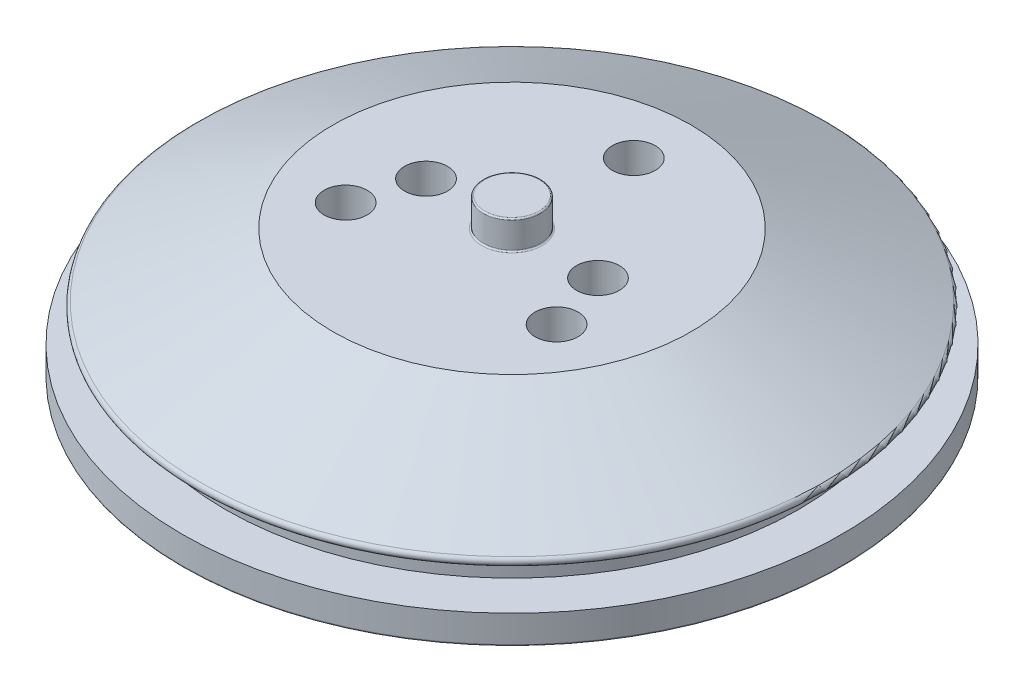
ISO-10303-21;
HEADER;
FILE_DESCRIPTION(('STEP AP214'),'2;1');
FILE_NAME('part.step','',(''),(''),'','','');
FILE_SCHEMA(('AUTOMOTIVE_DESIGN { 1 0 10303 214 1 1 1 1 }'));
ENDSEC;
DATA;
#1=APPLICATION_CONTEXT('core data for automotive mechanical design processes');
#2=APPLICATION_PROTOCOL_DEFINITION('international standard','automotive_design',2000,#1);
#3=PRODUCT_CONTEXT('',#1,'mechanical');
#4=PRODUCT('Part','Part','',(#3));
#5=PRODUCT_RELATED_PRODUCT_CATEGORY('part','',(#4));
#6=PRODUCT_DEFINITION_FORMATION('','',#4);
#7=PRODUCT_DEFINITION_CONTEXT('part definition',#1,'design');
#8=PRODUCT_DEFINITION('design','',#6,#7);
#9=PRODUCT_DEFINITION_SHAPE('','',#8);
#10=(LENGTH_UNIT() NAMED_UNIT(*) SI_UNIT(.MILLI.,.METRE.));
#11=(NAMED_UNIT(*) PLANE_ANGLE_UNIT() SI_UNIT($,.RADIAN.));
#12=(NAMED_UNIT(*) SI_UNIT($,.STERADIAN.) SOLID_ANGLE_UNIT());
#13=UNCERTAINTY_MEASURE_WITH_UNIT(LENGTH_MEASURE(1.E-05),#10,'distance_accuracy_value','');
#14=(GEOMETRIC_REPRESENTATION_CONTEXT(3) GLOBAL_UNCERTAINTY_ASSIGNED_CONTEXT((#13)) GLOBAL_UNIT_ASSIGNED_CONTEXT((#10,
#11,#12)) REPRESENTATION_CONTEXT('',''));
#15=CARTESIAN_POINT('',(0.,0.,0.));
#16=DIRECTION('',(0.,0.,1.));
#17=DIRECTION('',(1.,0.,0.));
#18=AXIS2_PLACEMENT_3D('',#15,#16,#17);
#19=CARTESIAN_POINT('',(0.,2.,0.));
#20=DIRECTION('',(0.,1.,0.));
#21=DIRECTION('',(0.,0.,1.));
#22=AXIS2_PLACEMENT_3D('',#19,#20,#21);
#23=PLANE('',#22);
#24=CARTESIAN_POINT('',(0.,2.,0.));
#25=DIRECTION('',(0.,-1.,0.));
#26=DIRECTION('',(0.,0.,-1.));
#27=AXIS2_PLACEMENT_3D('',#24,#25,#26);
#28=CIRCLE('',#27,1.9);
#29=CARTESIAN_POINT('',(0.,2.,-1.9));
#30=VERTEX_POINT('',#29);
#31=CARTESIAN_POINT('',(0.,2.,1.9));
#32=VERTEX_POINT('',#31);
#33=EDGE_CURVE('E63',#30,#32,#28,.T.);
#34=ORIENTED_EDGE('',*,*,#33,.F.);
#35=CARTESIAN_POINT('',(0.,2.,0.));
#36=DIRECTION('',(0.,-1.,0.));
#37=DIRECTION('',(0.,0.,1.));
#38=AXIS2_PLACEMENT_3D('',#35,#36,#37);
#39=CIRCLE('',#38,1.9);
#40=EDGE_CURVE('E61',#32,#30,#39,.T.);
#41=ORIENTED_EDGE('',*,*,#40,.F.);
#42=EDGE_LOOP('',(#34,#41));
#43=FACE_BOUND('',#42,.T.);
#44=ADVANCED_FACE('F24',(#43),#23,.T.);
#45=CARTESIAN_POINT('',(0.,1.9,0.));
#46=DIRECTION('',(0.,1.,0.));
#47=DIRECTION('',(0.,0.,1.));
#48=AXIS2_PLACEMENT_3D('',#45,#46,#47);
#49=TOROIDAL_SURFACE('',#48,1.9,0.1);
#50=ORIENTED_EDGE('',*,*,#40,.T.);
#51=ORIENTED_EDGE('',*,*,#33,.T.);
#52=EDGE_LOOP('',(#50,#51));
#53=FACE_BOUND('',#52,.T.);
#54=CARTESIAN_POINT('',(0.,1.9,0.));
#55=DIRECTION('',(0.,-1.,0.));
#56=DIRECTION('',(0.,0.,-1.));
#57=AXIS2_PLACEMENT_3D('',#54,#55,#56);
#58=CIRCLE('',#57,2.);
#59=CARTESIAN_POINT('',(0.,1.9,-2.));
#60=VERTEX_POINT('',#59);
#61=EDGE_CURVE('E69',#60,#60,#58,.T.);
#62=ORIENTED_EDGE('',*,*,#61,.F.);
#63=EDGE_LOOP('',(#62));
#64=FACE_BOUND('',#63,.T.);
#65=ADVANCED_FACE('F65',(#53,#64),#49,.T.);
#66=CARTESIAN_POINT('',(0.,2.,0.));
#67=DIRECTION('',(0.,-1.,0.));
#68=DIRECTION('',(0.,0.,-1.));
#69=AXIS2_PLACEMENT_3D('',#66,#67,#68);
#70=CYLINDRICAL_SURFACE('',#69,2.);
#71=CARTESIAN_POINT('',(0.,0.1,0.));
#72=DIRECTION('',(0.,1.,0.));
#73=DIRECTION('',(0.,0.,1.));
#74=AXIS2_PLACEMENT_3D('',#71,#72,#73);
#75=CIRCLE('',#74,2.);
#76=CARTESIAN_POINT('',(0.,0.1,2.));
#77=VERTEX_POINT('',#76);
#78=EDGE_CURVE('E153',#77,#77,#75,.T.);
#79=ORIENTED_EDGE('',*,*,#78,.T.);
#80=EDGE_LOOP('',(#79));
#81=FACE_BOUND('',#80,.T.);
#82=ORIENTED_EDGE('',*,*,#61,.T.);
#83=EDGE_LOOP('',(#82));
#84=FACE_BOUND('',#83,.T.);
#85=ADVANCED_FACE('F95',(#81,#84),#70,.T.);
#86=CARTESIAN_POINT('',(0.,-5.,0.));
#87=DIRECTION('',(0.,1.,0.));
#88=DIRECTION('',(0.,0.,1.));
#89=AXIS2_PLACEMENT_3D('',#86,#87,#88);
#90=PLANE('',#89);
#91=CARTESIAN_POINT('',(0.,-5.,-8.5));
#92=DIRECTION('',(0.,1.,0.));
#93=DIRECTION('',(0.,0.,1.));
#94=AXIS2_PLACEMENT_3D('',#91,#92,#93);
#95=CIRCLE('',#94,1.5);
#96=CARTESIAN_POINT('',(0.,-5.,-7.));
#97=VERTEX_POINT('',#96);
#98=EDGE_CURVE('E150',#97,#97,#95,.T.);
#99=ORIENTED_EDGE('',*,*,#98,.T.);
#100=EDGE_LOOP('',(#99));
#101=FACE_BOUND('',#100,.T.);
#102=ADVANCED_FACE('F317',(#101),#90,.T.);
#103=CARTESIAN_POINT('',(0.,-5.,0.));
#104=DIRECTION('',(0.,1.,0.));
#105=DIRECTION('',(0.,0.,1.));
#106=AXIS2_PLACEMENT_3D('',#103,#104,#105);
#107=PLANE('',#106);
#108=CARTESIAN_POINT('',(6.,-5.,0.));
#109=DIRECTION('',(0.,1.,0.));
#110=DIRECTION('',(0.,0.,1.));
#111=AXIS2_PLACEMENT_3D('',#108,#109,#110);
#112=CIRCLE('',#111,1.5);
#113=CARTESIAN_POINT('',(6.,-5.,1.5));
#114=VERTEX_POINT('',#113);
#115=EDGE_CURVE('E147',#114,#114,#112,.T.);
#116=ORIENTED_EDGE('',*,*,#115,.T.);
#117=EDGE_LOOP('',(#116));
#118=FACE_BOUND('',#117,.T.);
#119=ADVANCED_FACE('F322',(#118),#107,.T.);
#120=CARTESIAN_POINT('',(0.,-5.,0.));
#121=DIRECTION('',(0.,1.,0.));
#122=DIRECTION('',(0.,0.,1.));
#123=AXIS2_PLACEMENT_3D('',#120,#121,#122);
#124=PLANE('',#123);
#125=CARTESIAN_POINT('',(-6.,-5.,0.));
#126=DIRECTION('',(0.,1.,0.));
#127=DIRECTION('',(0.,0.,1.));
#128=AXIS2_PLACEMENT_3D('',#125,#126,#127);
#129=CIRCLE('',#128,1.5);
#130=CARTESIAN_POINT('',(-6.,-5.,1.5));
#131=VERTEX_POINT('',#130);
#132=EDGE_CURVE('E144',#131,#131,#129,.T.);
#133=ORIENTED_EDGE('',*,*,#132,.T.);
#134=EDGE_LOOP('',(#133));
#135=FACE_BOUND('',#134,.T.);
#136=ADVANCED_FACE('F432',(#135),#124,.T.);
#137=CARTESIAN_POINT('',(0.,-5.,0.));
#138=DIRECTION('',(0.,1.,0.));
#139=DIRECTION('',(0.,0.,1.));
#140=AXIS2_PLACEMENT_3D('',#137,#138,#139);
#141=PLANE('',#140);
#142=CARTESIAN_POINT('',(7.36121593216777,-5.,4.24999999999993));
#143=DIRECTION('',(0.,1.,0.));
#144=DIRECTION('',(0.,0.,1.));
#145=AXIS2_PLACEMENT_3D('',#142,#143,#144);
#146=CIRCLE('',#145,1.5);
#147=CARTESIAN_POINT('',(7.36121593216777,-5.,5.74999999999993));
#148=VERTEX_POINT('',#147);
#149=EDGE_CURVE('E141',#148,#148,#146,.T.);
#150=ORIENTED_EDGE('',*,*,#149,.T.);
#151=EDGE_LOOP('',(#150));
#152=FACE_BOUND('',#151,.T.);
#153=ADVANCED_FACE('F425',(#152),#141,.T.);
#154=CARTESIAN_POINT('',(0.,-5.,0.));
#155=DIRECTION('',(0.,1.,0.));
#156=DIRECTION('',(0.,0.,1.));
#157=AXIS2_PLACEMENT_3D('',#154,#155,#156);
#158=PLANE('',#157);
#159=CARTESIAN_POINT('',(-7.36121593216771,-5.,4.25000000000003));
#160=DIRECTION('',(0.,1.,0.));
#161=DIRECTION('',(0.,0.,1.));
#162=AXIS2_PLACEMENT_3D('',#159,#160,#161);
#163=CIRCLE('',#162,1.5);
#164=CARTESIAN_POINT('',(-7.36121593216771,-5.,5.75000000000003));
#165=VERTEX_POINT('',#164);
#166=EDGE_CURVE('E137',#165,#165,#163,.T.);
#167=ORIENTED_EDGE('',*,*,#166,.T.);
#168=EDGE_LOOP('',(#167));
#169=FACE_BOUND('',#168,.T.);
#170=ADVANCED_FACE('F281',(#169),#158,.T.);
#171=CARTESIAN_POINT('',(0.,0.1,0.));
#172=DIRECTION('',(0.,1.,0.));
#173=DIRECTION('',(0.,0.,1.));
#174=AXIS2_PLACEMENT_3D('',#171,#172,#173);
#175=TOROIDAL_SURFACE('',#174,2.1,0.1);
#176=ORIENTED_EDGE('',*,*,#78,.F.);
#177=EDGE_LOOP('',(#176));
#178=FACE_BOUND('',#177,.T.);
#179=CARTESIAN_POINT('',(0.,0.,0.));
#180=DIRECTION('',(0.,1.,0.));
#181=DIRECTION('',(0.,0.,-1.));
#182=AXIS2_PLACEMENT_3D('',#179,#180,#181);
#183=CIRCLE('',#182,2.1);
#184=CARTESIAN_POINT('',(0.,0.,2.1));
#185=VERTEX_POINT('',#184);
#186=CARTESIAN_POINT('',(0.,0.,-2.1));
#187=VERTEX_POINT('',#186);
#188=EDGE_CURVE('E140',#185,#187,#183,.F.);
#189=ORIENTED_EDGE('',*,*,#188,.F.);
#190=CARTESIAN_POINT('',(0.,0.,0.));
#191=DIRECTION('',(0.,1.,0.));
#192=DIRECTION('',(0.,0.,1.));
#193=AXIS2_PLACEMENT_3D('',#190,#191,#192);
#194=CIRCLE('',#193,2.1);
#195=EDGE_CURVE('E136',#187,#185,#194,.F.);
#196=ORIENTED_EDGE('',*,*,#195,.F.);
#197=EDGE_LOOP('',(#189,#196));
#198=FACE_BOUND('',#197,.T.);
#199=ADVANCED_FACE('F275',(#178,#198),#175,.F.);
#200=CARTESIAN_POINT('',(0.,-9.,-8.5));
#201=DIRECTION('',(0.,1.,0.));
#202=DIRECTION('',(0.,0.,1.));
#203=AXIS2_PLACEMENT_3D('',#200,#201,#202);
#204=CYLINDRICAL_SURFACE('',#203,1.5);
#205=CARTESIAN_POINT('',(0.,0.,-8.5));
#206=DIRECTION('',(0.,1.,0.));
#207=DIRECTION('',(0.,0.,1.));
#208=AXIS2_PLACEMENT_3D('',#205,#206,#207);
#209=CIRCLE('',#208,1.5);
#210=CARTESIAN_POINT('',(0.,0.,-7.));
#211=VERTEX_POINT('',#210);
#212=EDGE_CURVE('E133',#211,#211,#209,.F.);
#213=ORIENTED_EDGE('',*,*,#212,.F.);
#214=EDGE_LOOP('',(#213));
#215=FACE_BOUND('',#214,.T.);
#216=ORIENTED_EDGE('',*,*,#98,.F.);
#217=EDGE_LOOP('',(#216));
#218=FACE_BOUND('',#217,.T.);
#219=ADVANCED_FACE('F280',(#215,#218),#204,.F.);
#220=CARTESIAN_POINT('',(6.,-9.,0.));
#221=DIRECTION('',(0.,1.,0.));
#222=DIRECTION('',(0.,0.,1.));
#223=AXIS2_PLACEMENT_3D('',#220,#221,#222);
#224=CYLINDRICAL_SURFACE('',#223,1.5);
#225=CARTESIAN_POINT('',(6.,0.,0.));
#226=DIRECTION('',(0.,1.,0.));
#227=DIRECTION('',(0.,0.,1.));
#228=AXIS2_PLACEMENT_3D('',#225,#226,#227);
#229=CIRCLE('',#228,1.5);
#230=CARTESIAN_POINT('',(6.,0.,1.5));
#231=VERTEX_POINT('',#230);
#232=EDGE_CURVE('E130',#231,#231,#229,.F.);
#233=ORIENTED_EDGE('',*,*,#232,.F.);
#234=EDGE_LOOP('',(#233));
#235=FACE_BOUND('',#234,.T.);
#236=ORIENTED_EDGE('',*,*,#115,.F.);
#237=EDGE_LOOP('',(#236));
#238=FACE_BOUND('',#237,.T.);
#239=ADVANCED_FACE('F401',(#235,#238),#224,.F.);
#240=CARTESIAN_POINT('',(-6.,-9.,0.));
#241=DIRECTION('',(0.,1.,0.));
#242=DIRECTION('',(0.,0.,1.));
#243=AXIS2_PLACEMENT_3D('',#240,#241,#242);
#244=CYLINDRICAL_SURFACE('',#243,1.5);
#245=CARTESIAN_POINT('',(-6.,0.,0.));
#246=DIRECTION('',(0.,1.,0.));
#247=DIRECTION('',(0.,0.,1.));
#248=AXIS2_PLACEMENT_3D('',#245,#246,#247);
#249=CIRCLE('',#248,1.5);
#250=CARTESIAN_POINT('',(-6.,0.,1.5));
#251=VERTEX_POINT('',#250);
#252=EDGE_CURVE('E127',#251,#251,#249,.F.);
#253=ORIENTED_EDGE('',*,*,#252,.F.);
#254=EDGE_LOOP('',(#253));
#255=FACE_BOUND('',#254,.T.);
#256=ORIENTED_EDGE('',*,*,#132,.F.);
#257=EDGE_LOOP('',(#256));
#258=FACE_BOUND('',#257,.T.);
#259=ADVANCED_FACE('F394',(#255,#258),#244,.F.);
#260=CARTESIAN_POINT('',(7.36121593216777,-9.,4.24999999999993));
#261=DIRECTION('',(0.,1.,0.));
#262=DIRECTION('',(0.,0.,1.));
#263=AXIS2_PLACEMENT_3D('',#260,#261,#262);
#264=CYLINDRICAL_SURFACE('',#263,1.5);
#265=CARTESIAN_POINT('',(7.36121593216777,0.,4.24999999999993));
#266=DIRECTION('',(0.,1.,0.));
#267=DIRECTION('',(0.,0.,1.));
#268=AXIS2_PLACEMENT_3D('',#265,#266,#267);
#269=CIRCLE('',#268,1.5);
#270=CARTESIAN_POINT('',(7.36121593216777,0.,5.74999999999993));
#271=VERTEX_POINT('',#270);
#272=EDGE_CURVE('E124',#271,#271,#269,.F.);
#273=ORIENTED_EDGE('',*,*,#272,.F.);
#274=EDGE_LOOP('',(#273));
#275=FACE_BOUND('',#274,.T.);
#276=ORIENTED_EDGE('',*,*,#149,.F.);
#277=EDGE_LOOP('',(#276));
#278=FACE_BOUND('',#277,.T.);
#279=ADVANCED_FACE('F387',(#275,#278),#264,.F.);
#280=CARTESIAN_POINT('',(-7.36121593216771,-9.,4.25000000000003));
#281=DIRECTION('',(0.,1.,0.));
#282=DIRECTION('',(0.,0.,1.));
#283=AXIS2_PLACEMENT_3D('',#280,#281,#282);
#284=CYLINDRICAL_SURFACE('',#283,1.5);
#285=CARTESIAN_POINT('',(-7.36121593216771,0.,4.25000000000003));
#286=DIRECTION('',(0.,1.,0.));
#287=DIRECTION('',(0.,0.,1.));
#288=AXIS2_PLACEMENT_3D('',#285,#286,#287);
#289=CIRCLE('',#288,1.5);
#290=CARTESIAN_POINT('',(-7.36121593216771,0.,5.75000000000003));
#291=VERTEX_POINT('',#290);
#292=EDGE_CURVE('E121',#291,#291,#289,.F.);
#293=ORIENTED_EDGE('',*,*,#292,.F.);
#294=EDGE_LOOP('',(#293));
#295=FACE_BOUND('',#294,.T.);
#296=ORIENTED_EDGE('',*,*,#166,.F.);
#297=EDGE_LOOP('',(#296));
#298=FACE_BOUND('',#297,.T.);
#299=ADVANCED_FACE('F259',(#295,#298),#284,.F.);
#300=CARTESIAN_POINT('',(0.,0.,0.));
#301=DIRECTION('',(0.,1.,0.));
#302=DIRECTION('',(0.,0.,1.));
#303=AXIS2_PLACEMENT_3D('',#300,#301,#302);
#304=PLANE('',#303);
#305=CARTESIAN_POINT('',(0.,0.,0.));
#306=DIRECTION('',(0.,-1.,0.));
#307=DIRECTION('',(0.,0.,-1.));
#308=AXIS2_PLACEMENT_3D('',#305,#306,#307);
#309=CIRCLE('',#308,12.5);
#310=CARTESIAN_POINT('',(0.,0.,-12.5));
#311=VERTEX_POINT('',#310);
#312=EDGE_CURVE('E117',#311,#311,#309,.T.);
#313=ORIENTED_EDGE('',*,*,#312,.F.);
#314=EDGE_LOOP('',(#313));
#315=FACE_BOUND('',#314,.T.);
#316=ORIENTED_EDGE('',*,*,#292,.T.);
#317=EDGE_LOOP('',(#316));
#318=FACE_BOUND('',#317,.T.);
#319=ORIENTED_EDGE('',*,*,#272,.T.);
#320=EDGE_LOOP('',(#319));
#321=FACE_BOUND('',#320,.T.);
#322=ORIENTED_EDGE('',*,*,#252,.T.);
#323=EDGE_LOOP('',(#322));
#324=FACE_BOUND('',#323,.T.);
#325=ORIENTED_EDGE('',*,*,#232,.T.);
#326=EDGE_LOOP('',(#325));
#327=FACE_BOUND('',#326,.T.);
#328=ORIENTED_EDGE('',*,*,#212,.T.);
#329=EDGE_LOOP('',(#328));
#330=FACE_BOUND('',#329,.T.);
#331=ORIENTED_EDGE('',*,*,#188,.T.);
#332=ORIENTED_EDGE('',*,*,#195,.T.);
#333=EDGE_LOOP('',(#331,#332));
#334=FACE_BOUND('',#333,.T.);
#335=ADVANCED_FACE('F249',(#315,#318,#321,#324,#327,#330,#334),#304,.T.);
#336=CARTESIAN_POINT('',(0.,-4.42914184435282,0.));
#337=DIRECTION('',(0.,-1.,0.));
#338=DIRECTION('',(0.,0.,-1.));
#339=AXIS2_PLACEMENT_3D('',#336,#337,#338);
#340=CONICAL_SURFACE('',#339,21.8011978731409,1.1263771168938);
#341=ORIENTED_EDGE('',*,*,#312,.T.);
#342=EDGE_LOOP('',(#341));
#343=FACE_BOUND('',#342,.T.);
#344=CARTESIAN_POINT('',(0.,-4.42914184435282,0.));
#345=DIRECTION('',(0.,-1.,0.));
#346=DIRECTION('',(0.,0.,-1.));
#347=AXIS2_PLACEMENT_3D('',#344,#345,#346);
#348=CIRCLE('',#347,21.8011978731409);
#349=CARTESIAN_POINT('',(0.,-4.42914184435282,-21.8011978731409));
#350=VERTEX_POINT('',#349);
#351=EDGE_CURVE('E120',#350,#350,#348,.T.);
#352=ORIENTED_EDGE('',*,*,#351,.F.);
#353=EDGE_LOOP('',(#352));
#354=FACE_BOUND('',#353,.T.);
#355=ADVANCED_FACE('F258',(#343,#354),#340,.T.);
#356=CARTESIAN_POINT('',(0.,-4.7,0.));
#357=DIRECTION('',(0.,-1.,0.));
#358=DIRECTION('',(0.,0.,-1.));
#359=AXIS2_PLACEMENT_3D('',#356,#357,#358);
#360=TOROIDAL_SURFACE('',#359,21.6722177990232,0.3);
#361=ORIENTED_EDGE('',*,*,#351,.T.);
#362=EDGE_LOOP('',(#361));
#363=FACE_BOUND('',#362,.T.);
#364=CARTESIAN_POINT('',(0.,-5.,0.));
#365=DIRECTION('',(0.,1.,0.));
#366=DIRECTION('',(0.,0.,-1.));
#367=AXIS2_PLACEMENT_3D('',#364,#365,#366);
#368=CIRCLE('',#367,21.6722177990232);
#369=CARTESIAN_POINT('',(0.,-5.,21.6722177990232));
#370=VERTEX_POINT('',#369);
#371=CARTESIAN_POINT('',(0.,-5.,-21.6722177990232));
#372=VERTEX_POINT('',#371);
#373=EDGE_CURVE('E116',#370,#372,#368,.F.);
#374=ORIENTED_EDGE('',*,*,#373,.F.);
#375=CARTESIAN_POINT('',(0.,-5.,0.));
#376=DIRECTION('',(0.,1.,0.));
#377=DIRECTION('',(0.,0.,1.));
#378=AXIS2_PLACEMENT_3D('',#375,#376,#377);
#379=CIRCLE('',#378,21.6722177990232);
#380=EDGE_CURVE('E196',#372,#370,#379,.F.);
#381=ORIENTED_EDGE('',*,*,#380,.F.);
#382=EDGE_LOOP('',(#374,#381));
#383=FACE_BOUND('',#382,.T.);
#384=ADVANCED_FACE('F214',(#363,#383),#360,.T.);
#385=CARTESIAN_POINT('',(0.,-5.,12.5));
#386=DIRECTION('',(0.,-1.,0.));
#387=DIRECTION('',(0.,0.,-1.));
#388=AXIS2_PLACEMENT_3D('',#385,#386,#387);
#389=PLANE('',#388);
#390=ORIENTED_EDGE('',*,*,#380,.T.);
#391=ORIENTED_EDGE('',*,*,#373,.T.);
#392=EDGE_LOOP('',(#390,#391));
#393=FACE_BOUND('',#392,.T.);
#394=CARTESIAN_POINT('',(0.,-5.,0.));
#395=DIRECTION('',(0.,-1.,0.));
#396=DIRECTION('',(0.,0.,-1.));
#397=AXIS2_PLACEMENT_3D('',#394,#395,#396);
#398=CIRCLE('',#397,20.);
#399=CARTESIAN_POINT('',(0.,-5.,-20.));
#400=VERTEX_POINT('',#399);
#401=EDGE_CURVE('E113',#400,#400,#398,.T.);
#402=ORIENTED_EDGE('',*,*,#401,.F.);
#403=EDGE_LOOP('',(#402));
#404=FACE_BOUND('',#403,.T.);
#405=ADVANCED_FACE('F203',(#393,#404),#389,.T.);
#406=CARTESIAN_POINT('',(0.,-5.,0.));
#407=DIRECTION('',(0.,-1.,0.));
#408=DIRECTION('',(0.,0.,-1.));
#409=AXIS2_PLACEMENT_3D('',#406,#407,#408);
#410=CYLINDRICAL_SURFACE('',#409,20.);
#411=ORIENTED_EDGE('',*,*,#401,.T.);
#412=EDGE_LOOP('',(#411));
#413=FACE_BOUND('',#412,.T.);
#414=CARTESIAN_POINT('',(0.,-7.,0.));
#415=DIRECTION('',(0.,-1.,0.));
#416=DIRECTION('',(0.,0.,-1.));
#417=AXIS2_PLACEMENT_3D('',#414,#415,#416);
#418=CIRCLE('',#417,20.);
#419=CARTESIAN_POINT('',(0.,-7.,-20.));
#420=VERTEX_POINT('',#419);
#421=EDGE_CURVE('E110',#420,#420,#418,.T.);
#422=ORIENTED_EDGE('',*,*,#421,.F.);
#423=EDGE_LOOP('',(#422));
#424=FACE_BOUND('',#423,.T.);
#425=ADVANCED_FACE('F213',(#413,#424),#410,.T.);
#426=CARTESIAN_POINT('',(0.,-7.,0.));
#427=DIRECTION('',(0.,1.,0.));
#428=DIRECTION('',(0.,0.,1.));
#429=AXIS2_PLACEMENT_3D('',#426,#427,#428);
#430=PLANE('',#429);
#431=CARTESIAN_POINT('',(0.,-7.,0.));
#432=DIRECTION('',(0.,1.,0.));
#433=DIRECTION('',(0.,0.,1.));
#434=AXIS2_PLACEMENT_3D('',#431,#432,#433);
#435=CIRCLE('',#434,23.);
#436=CARTESIAN_POINT('',(0.,-7.,23.));
#437=VERTEX_POINT('',#436);
#438=EDGE_CURVE('E101',#437,#437,#435,.F.);
#439=ORIENTED_EDGE('',*,*,#438,.F.);
#440=EDGE_LOOP('',(#439));
#441=FACE_BOUND('',#440,.T.);
#442=ORIENTED_EDGE('',*,*,#421,.T.);
#443=EDGE_LOOP('',(#442));
#444=FACE_BOUND('',#443,.T.);
#445=ADVANCED_FACE('F348',(#441,#444),#430,.T.);
#446=CARTESIAN_POINT('',(0.,-9.,0.));
#447=DIRECTION('',(0.,1.,0.));
#448=DIRECTION('',(0.,0.,1.));
#449=AXIS2_PLACEMENT_3D('',#446,#447,#448);
#450=CYLINDRICAL_SURFACE('',#449,23.);
#451=CARTESIAN_POINT('',(0.,-8.9,0.));
#452=DIRECTION('',(0.,1.,0.));
#453=DIRECTION('',(0.,0.,1.));
#454=AXIS2_PLACEMENT_3D('',#451,#452,#453);
#455=CIRCLE('',#454,23.);
#456=CARTESIAN_POINT('',(0.,-8.9,23.));
#457=VERTEX_POINT('',#456);
#458=EDGE_CURVE('E109',#457,#457,#455,.F.);
#459=ORIENTED_EDGE('',*,*,#458,.F.);
#460=EDGE_LOOP('',(#459));
#461=FACE_BOUND('',#460,.T.);
#462=ORIENTED_EDGE('',*,*,#438,.T.);
#463=EDGE_LOOP('',(#462));
#464=FACE_BOUND('',#463,.T.);
#465=ADVANCED_FACE('F174',(#461,#464),#450,.T.);
#466=CARTESIAN_POINT('',(0.,-8.9,0.));
#467=DIRECTION('',(0.,1.,0.));
#468=DIRECTION('',(0.,0.,1.));
#469=AXIS2_PLACEMENT_3D('',#466,#467,#468);
#470=TOROIDAL_SURFACE('',#469,22.9,0.1);
#471=CARTESIAN_POINT('',(0.,-9.,0.));
#472=DIRECTION('',(0.,1.,0.));
#473=DIRECTION('',(0.,0.,1.));
#474=AXIS2_PLACEMENT_3D('',#471,#472,#473);
#475=CIRCLE('',#474,22.9);
#476=CARTESIAN_POINT('',(0.,-9.,22.9));
#477=VERTEX_POINT('',#476);
#478=CARTESIAN_POINT('',(0.,-9.,-22.9));
#479=VERTEX_POINT('',#478);
#480=EDGE_CURVE('E35',#477,#479,#475,.T.);
#481=ORIENTED_EDGE('',*,*,#480,.T.);
#482=CARTESIAN_POINT('',(0.,-9.,0.));
#483=DIRECTION('',(0.,1.,0.));
#484=DIRECTION('',(0.,0.,-1.));
#485=AXIS2_PLACEMENT_3D('',#482,#483,#484);
#486=CIRCLE('',#485,22.9);
#487=EDGE_CURVE('E13',#479,#477,#486,.T.);
#488=ORIENTED_EDGE('',*,*,#487,.T.);
#489=EDGE_LOOP('',(#481,#488));
#490=FACE_BOUND('',#489,.T.);
#491=ORIENTED_EDGE('',*,*,#458,.T.);
#492=EDGE_LOOP('',(#491));
#493=FACE_BOUND('',#492,.T.);
#494=ADVANCED_FACE('F162',(#490,#493),#470,.T.);
#495=CARTESIAN_POINT('',(0.,-9.,0.));
#496=DIRECTION('',(0.,1.,0.));
#497=DIRECTION('',(0.,0.,1.));
#498=AXIS2_PLACEMENT_3D('',#495,#496,#497);
#499=PLANE('',#498);
#500=ORIENTED_EDGE('',*,*,#480,.F.);
#501=ORIENTED_EDGE('',*,*,#487,.F.);
#502=EDGE_LOOP('',(#500,#501));
#503=FACE_BOUND('',#502,.T.);
#504=ADVANCED_FACE('F173',(#503),#499,.F.);
#505=CLOSED_SHELL('',(#44,#65,#85,#102,#119,#136,#153,#170,#199,#219,#239,#259,#279,#299,#335,
#355,#384,#405,#425,#445,#465,#494,#504));
#506=MANIFOLD_SOLID_BREP('B1',#505);
#507=ADVANCED_BREP_SHAPE_REPRESENTATION('',(#18,#506),#14);
#508=SHAPE_DEFINITION_REPRESENTATION(#9,#507);
ENDSEC;
END-ISO-10303-21;
